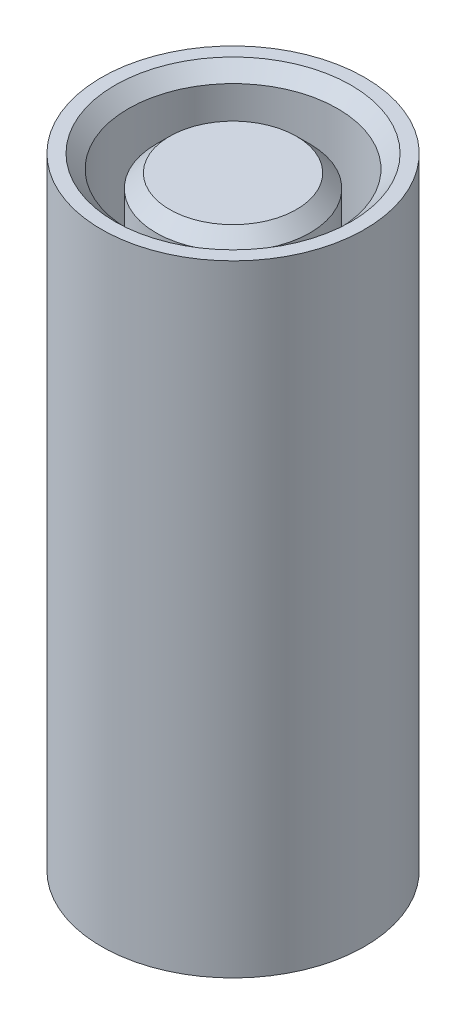
ISO-10303-21;
HEADER;
FILE_DESCRIPTION(('STEP AP214'),'2;1');
FILE_NAME('part.step','',(''),(''),'','','');
FILE_SCHEMA(('AUTOMOTIVE_DESIGN { 1 0 10303 214 1 1 1 1 }'));
ENDSEC;
DATA;
#1=APPLICATION_CONTEXT('core data for automotive mechanical design processes');
#2=APPLICATION_PROTOCOL_DEFINITION('international standard','automotive_design',2000,#1);
#3=PRODUCT_CONTEXT('',#1,'mechanical');
#4=PRODUCT('Part','Part','',(#3));
#5=PRODUCT_RELATED_PRODUCT_CATEGORY('part','',(#4));
#6=PRODUCT_DEFINITION_FORMATION('','',#4);
#7=PRODUCT_DEFINITION_CONTEXT('part definition',#1,'design');
#8=PRODUCT_DEFINITION('design','',#6,#7);
#9=PRODUCT_DEFINITION_SHAPE('','',#8);
#10=(LENGTH_UNIT() NAMED_UNIT(*) SI_UNIT(.MILLI.,.METRE.));
#11=(NAMED_UNIT(*) PLANE_ANGLE_UNIT() SI_UNIT($,.RADIAN.));
#12=(NAMED_UNIT(*) SI_UNIT($,.STERADIAN.) SOLID_ANGLE_UNIT());
#13=UNCERTAINTY_MEASURE_WITH_UNIT(LENGTH_MEASURE(1.E-05),#10,'distance_accuracy_value','');
#14=(GEOMETRIC_REPRESENTATION_CONTEXT(3) GLOBAL_UNCERTAINTY_ASSIGNED_CONTEXT((#13)) GLOBAL_UNIT_ASSIGNED_CONTEXT((#10,
#11,#12)) REPRESENTATION_CONTEXT('',''));
#15=CARTESIAN_POINT('',(0.,0.,0.));
#16=DIRECTION('',(0.,0.,1.));
#17=DIRECTION('',(1.,0.,0.));
#18=AXIS2_PLACEMENT_3D('',#15,#16,#17);
#19=CARTESIAN_POINT('',(0.,0.,0.));
#20=DIRECTION('',(0.,-1.,0.));
#21=DIRECTION('',(0.,0.,-1.));
#22=AXIS2_PLACEMENT_3D('',#19,#20,#21);
#23=CYLINDRICAL_SURFACE('',#22,3.9);
#24=CARTESIAN_POINT('',(0.,0.,0.));
#25=DIRECTION('',(0.,-1.,0.));
#26=DIRECTION('',(0.,0.,-1.));
#27=AXIS2_PLACEMENT_3D('',#24,#25,#26);
#28=CIRCLE('',#27,3.9);
#29=CARTESIAN_POINT('',(0.,0.,-3.9));
#30=VERTEX_POINT('',#29);
#31=EDGE_CURVE('E51',#30,#30,#28,.T.);
#32=ORIENTED_EDGE('',*,*,#31,.F.);
#33=EDGE_LOOP('',(#32));
#34=FACE_BOUND('',#33,.T.);
#35=CARTESIAN_POINT('',(0.,18.4,0.));
#36=DIRECTION('',(0.,-1.,0.));
#37=DIRECTION('',(0.,0.,-1.));
#38=AXIS2_PLACEMENT_3D('',#35,#36,#37);
#39=CIRCLE('',#38,3.9);
#40=CARTESIAN_POINT('',(0.,18.4,-3.9));
#41=VERTEX_POINT('',#40);
#42=EDGE_CURVE('E75',#41,#41,#39,.T.);
#43=ORIENTED_EDGE('',*,*,#42,.T.);
#44=EDGE_LOOP('',(#43));
#45=FACE_BOUND('',#44,.T.);
#46=ADVANCED_FACE('F32',(#34,#45),#23,.T.);
#47=CARTESIAN_POINT('',(-3.1,0.,0.));
#48=DIRECTION('',(0.,1.,0.));
#49=DIRECTION('',(0.,0.,1.));
#50=AXIS2_PLACEMENT_3D('',#47,#48,#49);
#51=PLANE('',#50);
#52=CARTESIAN_POINT('',(0.,0.,0.));
#53=DIRECTION('',(0.,-1.,0.));
#54=DIRECTION('',(0.,0.,-1.));
#55=AXIS2_PLACEMENT_3D('',#52,#53,#54);
#56=CIRCLE('',#55,3.1);
#57=CARTESIAN_POINT('',(0.,0.,-3.1));
#58=VERTEX_POINT('',#57);
#59=EDGE_CURVE('E54',#58,#58,#56,.T.);
#60=ORIENTED_EDGE('',*,*,#59,.F.);
#61=EDGE_LOOP('',(#60));
#62=FACE_BOUND('',#61,.T.);
#63=ORIENTED_EDGE('',*,*,#31,.T.);
#64=EDGE_LOOP('',(#63));
#65=FACE_BOUND('',#64,.T.);
#66=ADVANCED_FACE('F97',(#62,#65),#51,.F.);
#67=CARTESIAN_POINT('',(0.,0.,0.));
#68=DIRECTION('',(0.,-1.,0.));
#69=DIRECTION('',(0.,0.,-1.));
#70=AXIS2_PLACEMENT_3D('',#67,#68,#69);
#71=CYLINDRICAL_SURFACE('',#70,3.1);
#72=CARTESIAN_POINT('',(0.,3.,0.));
#73=DIRECTION('',(0.,-1.,0.));
#74=DIRECTION('',(0.,0.,-1.));
#75=AXIS2_PLACEMENT_3D('',#72,#73,#74);
#76=CIRCLE('',#75,3.1);
#77=CARTESIAN_POINT('',(0.,3.,-3.1));
#78=VERTEX_POINT('',#77);
#79=EDGE_CURVE('E57',#78,#78,#76,.T.);
#80=ORIENTED_EDGE('',*,*,#79,.F.);
#81=EDGE_LOOP('',(#80));
#82=FACE_BOUND('',#81,.T.);
#83=ORIENTED_EDGE('',*,*,#59,.T.);
#84=EDGE_LOOP('',(#83));
#85=FACE_BOUND('',#84,.T.);
#86=ADVANCED_FACE('F102',(#82,#85),#71,.F.);
#87=CARTESIAN_POINT('',(0.,3.,0.));
#88=DIRECTION('',(0.,-1.,0.));
#89=DIRECTION('',(0.,0.,-1.));
#90=AXIS2_PLACEMENT_3D('',#87,#88,#89);
#91=CONICAL_SURFACE('',#90,3.1,0.311422233456137);
#92=CARTESIAN_POINT('',(0.,5.54945779316473,0.));
#93=DIRECTION('',(0.,-1.,0.));
#94=DIRECTION('',(0.,0.,-1.));
#95=AXIS2_PLACEMENT_3D('',#92,#93,#94);
#96=CIRCLE('',#95,2.27933874168676);
#97=CARTESIAN_POINT('',(-2.27933874168676,5.54945779316473,0.));
#98=VERTEX_POINT('',#97);
#99=EDGE_CURVE('E60',#98,#98,#96,.T.);
#100=ORIENTED_EDGE('',*,*,#99,.F.);
#101=EDGE_LOOP('',(#100));
#102=FACE_BOUND('',#101,.T.);
#103=ORIENTED_EDGE('',*,*,#79,.T.);
#104=EDGE_LOOP('',(#103));
#105=FACE_BOUND('',#104,.T.);
#106=ADVANCED_FACE('F109',(#102,#105),#91,.F.);
#107=CARTESIAN_POINT('',(0.,7.5,0.));
#108=DIRECTION('',(0.,-1.,0.));
#109=DIRECTION('',(-1.,0.,0.));
#110=AXIS2_PLACEMENT_3D('',#107,#108,#109);
#111=SPHERICAL_SURFACE('',#110,3.);
#112=CARTESIAN_POINT('',(0.,10.0980762113533,0.));
#113=DIRECTION('',(0.,-1.,0.));
#114=DIRECTION('',(0.,0.,-1.));
#115=AXIS2_PLACEMENT_3D('',#112,#113,#114);
#116=CIRCLE('',#115,1.5);
#117=CARTESIAN_POINT('',(-1.5,10.0980762113533,0.));
#118=VERTEX_POINT('',#117);
#119=EDGE_CURVE('E63',#118,#118,#116,.T.);
#120=CARTESIAN_POINT('',(-1.5,10.0980762113533,0.));
#121=CARTESIAN_POINT('',(-1.54749750353731,10.0706553879519,0.));
#122=CARTESIAN_POINT('',(-1.59424130396566,10.0419294209603,0.));
#123=CARTESIAN_POINT('',(-1.68608483212604,9.98195955481073,0.));
#124=CARTESIAN_POINT('',(-1.73118455985809,9.95071565565275,0.));
#125=CARTESIAN_POINT('',(-1.81960327614754,9.8858022801844,0.));
#126=CARTESIAN_POINT('',(-1.86292226470495,9.85213280387402,0.));
#127=CARTESIAN_POINT('',(-1.94764951585253,9.78246995205006,0.));
#128=CARTESIAN_POINT('',(-1.98905777844271,9.74647657653646,0.));
#129=CARTESIAN_POINT('',(-2.06983898174341,9.67227404894022,0.));
#130=CARTESIAN_POINT('',(-2.10921192245395,9.63406489685758,0.));
#131=CARTESIAN_POINT('',(-2.1858041017149,9.55554574759769,0.));
#132=CARTESIAN_POINT('',(-2.22302334026532,9.51523575042045,0.));
#133=CARTESIAN_POINT('',(-2.2951961859482,9.43263612097342,0.));
#134=CARTESIAN_POINT('',(-2.33014979308067,9.39034648870363,0.));
#135=CARTESIAN_POINT('',(-2.3976862665944,9.30391476259359,0.));
#136=CARTESIAN_POINT('',(-2.43026913297567,9.25977266875335,0.));
#137=CARTESIAN_POINT('',(-2.49296614299956,9.16976876085398,0.));
#138=CARTESIAN_POINT('',(-2.52308028664218,9.12390694679484,0.));
#139=CARTESIAN_POINT('',(-2.58074929351375,9.03060151201857,0.));
#140=CARTESIAN_POINT('',(-2.60830415674272,8.98315789130142,0.));
#141=CARTESIAN_POINT('',(-2.66077174112338,8.88683151330037,0.));
#142=CARTESIAN_POINT('',(-2.68568446227509,8.83794875601646,0.));
#143=CARTESIAN_POINT('',(-2.73279284619318,8.73889110272806,0.));
#144=CARTESIAN_POINT('',(-2.75498850895955,8.68871620672357,0.));
#145=CARTESIAN_POINT('',(-2.79659603039442,8.58722515948206,0.));
#146=CARTESIAN_POINT('',(-2.81600788906293,8.53590900824503,0.));
#147=CARTESIAN_POINT('',(-2.85198942791145,8.43228976595724,0.));
#148=CARTESIAN_POINT('',(-2.86855910809147,8.37998667490647,0.));
#149=CARTESIAN_POINT('',(-2.89880646243178,8.27455083628603,0.));
#150=CARTESIAN_POINT('',(-2.91248413659206,8.22141808871636,0.));
#151=CARTESIAN_POINT('',(-2.93690634806075,8.11448271525571,0.));
#152=CARTESIAN_POINT('',(-2.94765088536915,8.06068008936473,0.));
#153=CARTESIAN_POINT('',(-2.96617451268742,7.95256675188428,0.));
#154=CARTESIAN_POINT('',(-2.9739536026973,7.89825604029481,0.));
#155=CARTESIAN_POINT('',(-2.98652294251987,7.78928985193064,0.));
#156=CARTESIAN_POINT('',(-2.99131319233256,7.73463437515595,0.));
#157=CARTESIAN_POINT('',(-2.99789044675596,7.62514301369563,0.));
#158=CARTESIAN_POINT('',(-2.99967745136667,7.57030712901001,0.));
#159=CARTESIAN_POINT('',(-3.00024284159353,7.46061985151578,0.));
#160=CARTESIAN_POINT('',(-2.99902122720967,7.40576845870718,0.));
#161=CARTESIAN_POINT('',(-2.9935730530256,7.29621511139094,0.));
#162=CARTESIAN_POINT('',(-2.98934649322539,7.2415131568833,0.));
#163=CARTESIAN_POINT('',(-2.97790113811522,7.13242318320661,0.));
#164=CARTESIAN_POINT('',(-2.97068234280526,7.07803516403756,0.));
#165=CARTESIAN_POINT('',(-2.95327422467269,6.96973661403514,0.));
#166=CARTESIAN_POINT('',(-2.94308490185008,6.91582608320177,0.));
#167=CARTESIAN_POINT('',(-2.91976636956532,6.80864462694917,0.));
#168=CARTESIAN_POINT('',(-2.90663716010318,6.75537370152993,0.));
#169=CARTESIAN_POINT('',(-2.87747833590485,6.64963164993992,0.));
#170=CARTESIAN_POINT('',(-2.86144872116865,6.59716052376914,0.));
#171=CARTESIAN_POINT('',(-2.82653729045671,6.49317585884841,0.));
#172=CARTESIAN_POINT('',(-2.80765547448097,6.44166232009846,0.));
#173=CARTESIAN_POINT('',(-2.76709641966614,6.33974774061505,0.));
#174=CARTESIAN_POINT('',(-2.74541918082704,6.2893466998816,0.));
#175=CARTESIAN_POINT('',(-2.69933447484126,6.18980867398876,0.));
#176=CARTESIAN_POINT('',(-2.67492700769457,6.14067168882938,0.));
#177=CARTESIAN_POINT('',(-2.62345521283345,6.04380955875702,0.));
#178=CARTESIAN_POINT('',(-2.59639088511902,5.99608441384403,0.));
#179=CARTESIAN_POINT('',(-2.53968686462181,5.90218939762526,0.));
#180=CARTESIAN_POINT('',(-2.51004717183902,5.85601952631946,0.));
#181=CARTESIAN_POINT('',(-2.44828114552712,5.76537420819101,0.));
#182=CARTESIAN_POINT('',(-2.41615481199801,5.72089876136836,0.));
#183=CARTESIAN_POINT('',(-2.34951363079779,5.63377487555518,0.));
#184=CARTESIAN_POINT('',(-2.31499878312669,5.59112643656467,0.));
#185=CARTESIAN_POINT('',(-2.27933874168676,5.54945779316473,0.));
#186=B_SPLINE_CURVE_WITH_KNOTS('',3,(#120,#121,#122,#123,#124,#125,#126,#127,#128,#129,#130,
#131,#132,#133,#134,#135,#136,#137,#138,#139,#140,#141,#142,#143,#144,#145,#146,#147,#148,#149,
#150,#151,#152,#153,#154,#155,#156,#157,#158,#159,#160,#161,#162,#163,#164,#165,#166,#167,#168,
#169,#170,#171,#172,#173,#174,#175,#176,#177,#178,#179,#180,#181,#182,#183,#184,#185),
.UNSPECIFIED.,.F.,.F.,(4,2,2,2,2,2,2,2,2,2,2,2,2,2,2,2,2,2,2,2,2,2,2,2,2,2,2,2,2,2,2,2,4),(0.,
0.164512490199257,0.329024980398513,0.493537470597769,0.658049960797026,0.822562450996282,
0.987074941195537,1.15158743139479,1.31609992159405,1.48061241179331,1.64512490199256,
1.80963739219182,1.97414988239108,2.13866237259033,2.30317486278959,2.46768735298884,
2.6321998431881,2.79671233338736,2.96122482358661,3.12573731378587,3.29024980398513,
3.45476229418438,3.61927478438364,3.78378727458289,3.94829976478215,4.11281225498141,
4.27732474518066,4.44183723537992,4.60634972557918,4.77086221577843,4.93537470597769,
5.09988719617695,5.2643996863762),.UNSPECIFIED.);
#187=EDGE_CURVE('BSEAM116',#118,#98,#186,.T.);
#188=ORIENTED_EDGE('',*,*,#119,.F.);
#189=ORIENTED_EDGE('',*,*,#99,.T.);
#190=ORIENTED_EDGE('',*,*,#187,.T.);
#191=ORIENTED_EDGE('',*,*,#187,.F.);
#192=EDGE_LOOP('',(#188,#190,#189,#191));
#193=FACE_BOUND('',#192,.T.);
#194=ADVANCED_FACE('F116',(#193),#111,.F.);
#195=CARTESIAN_POINT('',(0.,0.,0.));
#196=DIRECTION('',(0.,-1.,0.));
#197=DIRECTION('',(0.,0.,-1.));
#198=AXIS2_PLACEMENT_3D('',#195,#196,#197);
#199=CYLINDRICAL_SURFACE('',#198,1.5);
#200=CARTESIAN_POINT('',(0.,16.9,0.));
#201=DIRECTION('',(0.,-1.,0.));
#202=DIRECTION('',(0.,0.,-1.));
#203=AXIS2_PLACEMENT_3D('',#200,#201,#202);
#204=CIRCLE('',#203,1.5);
#205=CARTESIAN_POINT('',(0.,16.9,-1.5));
#206=VERTEX_POINT('',#205);
#207=EDGE_CURVE('E66',#206,#206,#204,.T.);
#208=ORIENTED_EDGE('',*,*,#207,.F.);
#209=EDGE_LOOP('',(#208));
#210=FACE_BOUND('',#209,.T.);
#211=ORIENTED_EDGE('',*,*,#119,.T.);
#212=EDGE_LOOP('',(#211));
#213=FACE_BOUND('',#212,.T.);
#214=ADVANCED_FACE('F120',(#210,#213),#199,.F.);
#215=CARTESIAN_POINT('',(-1.5,16.9,0.));
#216=DIRECTION('',(0.,1.,0.));
#217=DIRECTION('',(0.,0.,1.));
#218=AXIS2_PLACEMENT_3D('',#215,#216,#217);
#219=PLANE('',#218);
#220=ORIENTED_EDGE('',*,*,#207,.T.);
#221=EDGE_LOOP('',(#220));
#222=FACE_BOUND('',#221,.T.);
#223=ADVANCED_FACE('F124',(#222),#219,.F.);
#224=CARTESIAN_POINT('',(0.,17.9,0.));
#225=DIRECTION('',(0.,-1.,0.));
#226=DIRECTION('',(0.,0.,-1.));
#227=AXIS2_PLACEMENT_3D('',#224,#225,#226);
#228=PLANE('',#227);
#229=CARTESIAN_POINT('',(0.,17.9,0.));
#230=DIRECTION('',(0.,-1.,0.));
#231=DIRECTION('',(0.,0.,-1.));
#232=AXIS2_PLACEMENT_3D('',#229,#230,#231);
#233=CIRCLE('',#232,1.87933874168675);
#234=CARTESIAN_POINT('',(0.,17.9,-1.87933874168675));
#235=VERTEX_POINT('',#234);
#236=EDGE_CURVE('E10',#235,#235,#233,.F.);
#237=ORIENTED_EDGE('',*,*,#236,.T.);
#238=EDGE_LOOP('',(#237));
#239=FACE_BOUND('',#238,.T.);
#240=ADVANCED_FACE('F128',(#239),#228,.F.);
#241=CARTESIAN_POINT('',(0.,0.,0.));
#242=DIRECTION('',(0.,-1.,0.));
#243=DIRECTION('',(0.,0.,-1.));
#244=AXIS2_PLACEMENT_3D('',#241,#242,#243);
#245=CYLINDRICAL_SURFACE('',#244,2.27933874168675);
#246=CARTESIAN_POINT('',(0.,17.5,0.));
#247=DIRECTION('',(0.,-1.,0.));
#248=DIRECTION('',(0.,0.,-1.));
#249=AXIS2_PLACEMENT_3D('',#246,#247,#248);
#250=CIRCLE('',#249,2.27933874168675);
#251=CARTESIAN_POINT('',(0.,17.5,-2.27933874168675));
#252=VERTEX_POINT('',#251);
#253=EDGE_CURVE('E38',#252,#252,#250,.T.);
#254=ORIENTED_EDGE('',*,*,#253,.T.);
#255=EDGE_LOOP('',(#254));
#256=FACE_BOUND('',#255,.T.);
#257=CARTESIAN_POINT('',(0.,15.,0.));
#258=DIRECTION('',(0.,-1.,0.));
#259=DIRECTION('',(0.,0.,-1.));
#260=AXIS2_PLACEMENT_3D('',#257,#258,#259);
#261=CIRCLE('',#260,2.27933874168675);
#262=CARTESIAN_POINT('',(0.,15.,-2.27933874168675));
#263=VERTEX_POINT('',#262);
#264=EDGE_CURVE('E69',#263,#263,#261,.T.);
#265=ORIENTED_EDGE('',*,*,#264,.F.);
#266=EDGE_LOOP('',(#265));
#267=FACE_BOUND('',#266,.T.);
#268=ADVANCED_FACE('F132',(#256,#267),#245,.T.);
#269=CARTESIAN_POINT('',(-3.1,15.,0.));
#270=DIRECTION('',(0.,-1.,0.));
#271=DIRECTION('',(0.,0.,-1.));
#272=AXIS2_PLACEMENT_3D('',#269,#270,#271);
#273=PLANE('',#272);
#274=CARTESIAN_POINT('',(0.,15.,0.));
#275=DIRECTION('',(0.,-1.,0.));
#276=DIRECTION('',(0.,0.,-1.));
#277=AXIS2_PLACEMENT_3D('',#274,#275,#276);
#278=CIRCLE('',#277,3.1);
#279=CARTESIAN_POINT('',(0.,15.,-3.1));
#280=VERTEX_POINT('',#279);
#281=EDGE_CURVE('E72',#280,#280,#278,.T.);
#282=ORIENTED_EDGE('',*,*,#281,.F.);
#283=EDGE_LOOP('',(#282));
#284=FACE_BOUND('',#283,.T.);
#285=ORIENTED_EDGE('',*,*,#264,.T.);
#286=EDGE_LOOP('',(#285));
#287=FACE_BOUND('',#286,.T.);
#288=ADVANCED_FACE('F93',(#284,#287),#273,.F.);
#289=CARTESIAN_POINT('',(0.,0.,0.));
#290=DIRECTION('',(0.,-1.,0.));
#291=DIRECTION('',(0.,0.,-1.));
#292=AXIS2_PLACEMENT_3D('',#289,#290,#291);
#293=CYLINDRICAL_SURFACE('',#292,3.1);
#294=CARTESIAN_POINT('',(0.,18.,0.));
#295=DIRECTION('',(0.,-1.,0.));
#296=DIRECTION('',(0.,0.,-1.));
#297=AXIS2_PLACEMENT_3D('',#294,#295,#296);
#298=CIRCLE('',#297,3.1);
#299=CARTESIAN_POINT('',(0.,18.,-3.1));
#300=VERTEX_POINT('',#299);
#301=EDGE_CURVE('E42',#300,#300,#298,.F.);
#302=ORIENTED_EDGE('',*,*,#301,.T.);
#303=EDGE_LOOP('',(#302));
#304=FACE_BOUND('',#303,.T.);
#305=ORIENTED_EDGE('',*,*,#281,.T.);
#306=EDGE_LOOP('',(#305));
#307=FACE_BOUND('',#306,.T.);
#308=ADVANCED_FACE('F83',(#304,#307),#293,.F.);
#309=CARTESIAN_POINT('',(-3.9,18.4,0.));
#310=DIRECTION('',(0.,-1.,0.));
#311=DIRECTION('',(0.,0.,-1.));
#312=AXIS2_PLACEMENT_3D('',#309,#310,#311);
#313=PLANE('',#312);
#314=CARTESIAN_POINT('',(0.,18.4,0.));
#315=DIRECTION('',(0.,-1.,0.));
#316=DIRECTION('',(0.,0.,-1.));
#317=AXIS2_PLACEMENT_3D('',#314,#315,#316);
#318=CIRCLE('',#317,3.5);
#319=CARTESIAN_POINT('',(0.,18.4,-3.5));
#320=VERTEX_POINT('',#319);
#321=EDGE_CURVE('E46',#320,#320,#318,.T.);
#322=ORIENTED_EDGE('',*,*,#321,.T.);
#323=EDGE_LOOP('',(#322));
#324=FACE_BOUND('',#323,.T.);
#325=ORIENTED_EDGE('',*,*,#42,.F.);
#326=EDGE_LOOP('',(#325));
#327=FACE_BOUND('',#326,.T.);
#328=ADVANCED_FACE('F80',(#324,#327),#313,.F.);
#329=CARTESIAN_POINT('',(0.,18.4,0.));
#330=DIRECTION('',(0.,1.,0.));
#331=DIRECTION('',(0.,0.,1.));
#332=AXIS2_PLACEMENT_3D('',#329,#330,#331);
#333=CONICAL_SURFACE('',#332,3.5,0.785398163397447);
#334=ORIENTED_EDGE('',*,*,#301,.F.);
#335=EDGE_LOOP('',(#334));
#336=FACE_BOUND('',#335,.T.);
#337=ORIENTED_EDGE('',*,*,#321,.F.);
#338=EDGE_LOOP('',(#337));
#339=FACE_BOUND('',#338,.T.);
#340=ADVANCED_FACE('F82',(#336,#339),#333,.F.);
#341=CARTESIAN_POINT('',(0.,17.5,0.));
#342=DIRECTION('',(0.,-1.,0.));
#343=DIRECTION('',(0.,0.,-1.));
#344=AXIS2_PLACEMENT_3D('',#341,#342,#343);
#345=CONICAL_SURFACE('',#344,2.27933874168675,0.785398163397446);
#346=ORIENTED_EDGE('',*,*,#236,.F.);
#347=EDGE_LOOP('',(#346));
#348=FACE_BOUND('',#347,.T.);
#349=ORIENTED_EDGE('',*,*,#253,.F.);
#350=EDGE_LOOP('',(#349));
#351=FACE_BOUND('',#350,.T.);
#352=ADVANCED_FACE('F90',(#348,#351),#345,.T.);
#353=CLOSED_SHELL('',(#46,#66,#86,#106,#194,#214,#223,#240,#268,#288,#308,#328,#340,#352));
#354=MANIFOLD_SOLID_BREP('B2',#353);
#355=ADVANCED_BREP_SHAPE_REPRESENTATION('',(#18,#354),#14);
#356=SHAPE_DEFINITION_REPRESENTATION(#9,#355);
ENDSEC;
END-ISO-10303-21;
